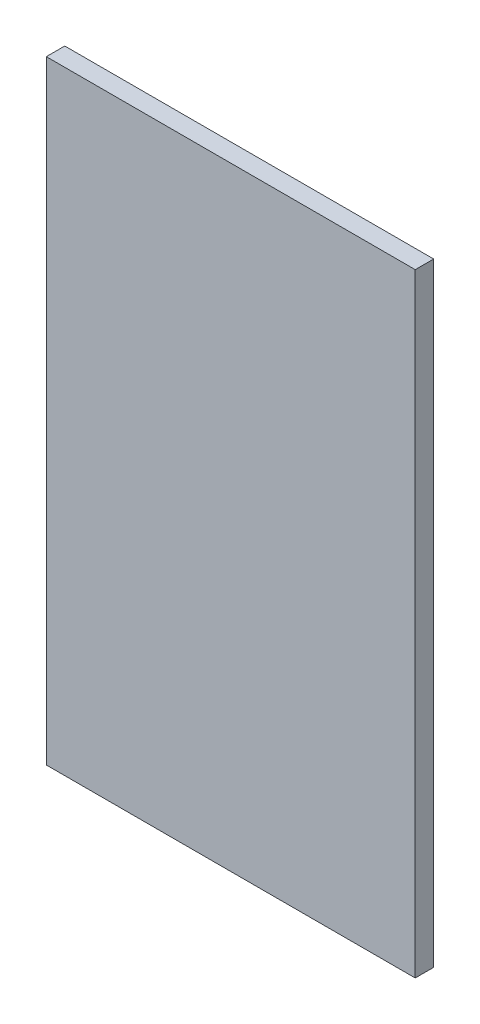
ISO-10303-21;
HEADER;
FILE_DESCRIPTION(('STEP AP214'),'2;1');
FILE_NAME('part.step','',(''),(''),'','','');
FILE_SCHEMA(('AUTOMOTIVE_DESIGN { 1 0 10303 214 1 1 1 1 }'));
ENDSEC;
DATA;
#1=APPLICATION_CONTEXT('core data for automotive mechanical design processes');
#2=APPLICATION_PROTOCOL_DEFINITION('international standard','automotive_design',2000,#1);
#3=PRODUCT_CONTEXT('',#1,'mechanical');
#4=PRODUCT('Part','Part','',(#3));
#5=PRODUCT_RELATED_PRODUCT_CATEGORY('part','',(#4));
#6=PRODUCT_DEFINITION_FORMATION('','',#4);
#7=PRODUCT_DEFINITION_CONTEXT('part definition',#1,'design');
#8=PRODUCT_DEFINITION('design','',#6,#7);
#9=PRODUCT_DEFINITION_SHAPE('','',#8);
#10=(LENGTH_UNIT() NAMED_UNIT(*) SI_UNIT(.MILLI.,.METRE.));
#11=(NAMED_UNIT(*) PLANE_ANGLE_UNIT() SI_UNIT($,.RADIAN.));
#12=(NAMED_UNIT(*) SI_UNIT($,.STERADIAN.) SOLID_ANGLE_UNIT());
#13=UNCERTAINTY_MEASURE_WITH_UNIT(LENGTH_MEASURE(1.E-05),#10,'distance_accuracy_value','');
#14=(GEOMETRIC_REPRESENTATION_CONTEXT(3) GLOBAL_UNCERTAINTY_ASSIGNED_CONTEXT((#13)) GLOBAL_UNIT_ASSIGNED_CONTEXT((#10,
#11,#12)) REPRESENTATION_CONTEXT('',''));
#15=CARTESIAN_POINT('',(0.,0.,0.));
#16=DIRECTION('',(0.,0.,1.));
#17=DIRECTION('',(1.,0.,0.));
#18=AXIS2_PLACEMENT_3D('',#15,#16,#17);
#19=CARTESIAN_POINT('',(0.,1662.9,50.));
#20=DIRECTION('',(1.,0.,0.));
#21=DIRECTION('',(0.,1.,0.));
#22=AXIS2_PLACEMENT_3D('',#19,#20,#21);
#23=PLANE('',#22);
#24=DIRECTION('',(0.,-1.,0.));
#25=VECTOR('',#24,1.);
#26=CARTESIAN_POINT('',(0.,1662.9,0.));
#27=LINE('',#26,#25);
#28=CARTESIAN_POINT('',(0.,1662.9,0.));
#29=VERTEX_POINT('',#28);
#30=CARTESIAN_POINT('',(0.,0.,0.));
#31=VERTEX_POINT('',#30);
#32=EDGE_CURVE('E111',#29,#31,#27,.T.);
#33=ORIENTED_EDGE('',*,*,#32,.T.);
#34=DIRECTION('',(0.,0.,-1.));
#35=VECTOR('',#34,1.);
#36=CARTESIAN_POINT('',(0.,0.,50.));
#37=LINE('',#36,#35);
#38=CARTESIAN_POINT('',(0.,0.,50.));
#39=VERTEX_POINT('',#38);
#40=EDGE_CURVE('E11',#39,#31,#37,.T.);
#41=ORIENTED_EDGE('',*,*,#40,.F.);
#42=DIRECTION('',(0.,-1.,0.));
#43=VECTOR('',#42,1.);
#44=CARTESIAN_POINT('',(0.,1662.9,50.));
#45=LINE('',#44,#43);
#46=CARTESIAN_POINT('',(0.,1662.9,50.));
#47=VERTEX_POINT('',#46);
#48=EDGE_CURVE('E95',#47,#39,#45,.T.);
#49=ORIENTED_EDGE('',*,*,#48,.F.);
#50=DIRECTION('',(0.,0.,-1.));
#51=VECTOR('',#50,1.);
#52=CARTESIAN_POINT('',(0.,1662.9,50.));
#53=LINE('',#52,#51);
#54=EDGE_CURVE('E107',#47,#29,#53,.T.);
#55=ORIENTED_EDGE('',*,*,#54,.T.);
#56=EDGE_LOOP('',(#33,#41,#49,#55));
#57=FACE_BOUND('',#56,.T.);
#58=ADVANCED_FACE('F43',(#57),#23,.F.);
#59=CARTESIAN_POINT('',(0.,0.,50.));
#60=DIRECTION('',(0.,1.,0.));
#61=DIRECTION('',(0.,0.,1.));
#62=AXIS2_PLACEMENT_3D('',#59,#60,#61);
#63=PLANE('',#62);
#64=DIRECTION('',(1.,0.,0.));
#65=VECTOR('',#64,1.);
#66=CARTESIAN_POINT('',(0.,0.,0.));
#67=LINE('',#66,#65);
#68=CARTESIAN_POINT('',(1000.,0.,0.));
#69=VERTEX_POINT('',#68);
#70=EDGE_CURVE('E100',#31,#69,#67,.T.);
#71=ORIENTED_EDGE('',*,*,#70,.T.);
#72=DIRECTION('',(0.,0.,-1.));
#73=VECTOR('',#72,1.);
#74=CARTESIAN_POINT('',(1000.,0.,50.));
#75=LINE('',#74,#73);
#76=CARTESIAN_POINT('',(1000.,0.,50.));
#77=VERTEX_POINT('',#76);
#78=EDGE_CURVE('E52',#77,#69,#75,.T.);
#79=ORIENTED_EDGE('',*,*,#78,.F.);
#80=DIRECTION('',(1.,0.,0.));
#81=VECTOR('',#80,1.);
#82=CARTESIAN_POINT('',(0.,0.,50.));
#83=LINE('',#82,#81);
#84=EDGE_CURVE('E90',#39,#77,#83,.T.);
#85=ORIENTED_EDGE('',*,*,#84,.F.);
#86=ORIENTED_EDGE('',*,*,#40,.T.);
#87=EDGE_LOOP('',(#71,#79,#85,#86));
#88=FACE_BOUND('',#87,.T.);
#89=ADVANCED_FACE('F99',(#88),#63,.F.);
#90=CARTESIAN_POINT('',(1000.,0.,50.));
#91=DIRECTION('',(-1.,0.,0.));
#92=DIRECTION('',(0.,0.,1.));
#93=AXIS2_PLACEMENT_3D('',#90,#91,#92);
#94=PLANE('',#93);
#95=DIRECTION('',(0.,1.,0.));
#96=VECTOR('',#95,1.);
#97=CARTESIAN_POINT('',(1000.,0.,0.));
#98=LINE('',#97,#96);
#99=CARTESIAN_POINT('',(1000.,1662.9,0.));
#100=VERTEX_POINT('',#99);
#101=EDGE_CURVE('E77',#69,#100,#98,.T.);
#102=ORIENTED_EDGE('',*,*,#101,.T.);
#103=DIRECTION('',(0.,0.,-1.));
#104=VECTOR('',#103,1.);
#105=CARTESIAN_POINT('',(1000.,1662.9,50.));
#106=LINE('',#105,#104);
#107=CARTESIAN_POINT('',(1000.,1662.9,50.));
#108=VERTEX_POINT('',#107);
#109=EDGE_CURVE('E102',#108,#100,#106,.T.);
#110=ORIENTED_EDGE('',*,*,#109,.F.);
#111=DIRECTION('',(0.,1.,0.));
#112=VECTOR('',#111,1.);
#113=CARTESIAN_POINT('',(1000.,0.,50.));
#114=LINE('',#113,#112);
#115=EDGE_CURVE('E93',#77,#108,#114,.T.);
#116=ORIENTED_EDGE('',*,*,#115,.F.);
#117=ORIENTED_EDGE('',*,*,#78,.T.);
#118=EDGE_LOOP('',(#102,#110,#116,#117));
#119=FACE_BOUND('',#118,.T.);
#120=ADVANCED_FACE('F103',(#119),#94,.F.);
#121=CARTESIAN_POINT('',(1000.,1662.9,50.));
#122=DIRECTION('',(0.,-1.,0.));
#123=DIRECTION('',(1.,0.,0.));
#124=AXIS2_PLACEMENT_3D('',#121,#122,#123);
#125=PLANE('',#124);
#126=DIRECTION('',(-1.,0.,0.));
#127=VECTOR('',#126,1.);
#128=CARTESIAN_POINT('',(1000.,1662.9,0.));
#129=LINE('',#128,#127);
#130=EDGE_CURVE('E83',#100,#29,#129,.T.);
#131=ORIENTED_EDGE('',*,*,#130,.T.);
#132=ORIENTED_EDGE('',*,*,#54,.F.);
#133=DIRECTION('',(-1.,0.,0.));
#134=VECTOR('',#133,1.);
#135=CARTESIAN_POINT('',(1000.,1662.9,50.));
#136=LINE('',#135,#134);
#137=EDGE_CURVE('E60',#108,#47,#136,.T.);
#138=ORIENTED_EDGE('',*,*,#137,.F.);
#139=ORIENTED_EDGE('',*,*,#109,.T.);
#140=EDGE_LOOP('',(#131,#132,#138,#139));
#141=FACE_BOUND('',#140,.T.);
#142=ADVANCED_FACE('F124',(#141),#125,.F.);
#143=CARTESIAN_POINT('',(0.,0.,50.));
#144=DIRECTION('',(0.,0.,1.));
#145=DIRECTION('',(1.,0.,0.));
#146=AXIS2_PLACEMENT_3D('',#143,#144,#145);
#147=PLANE('',#146);
#148=ORIENTED_EDGE('',*,*,#48,.T.);
#149=ORIENTED_EDGE('',*,*,#84,.T.);
#150=ORIENTED_EDGE('',*,*,#115,.T.);
#151=ORIENTED_EDGE('',*,*,#137,.T.);
#152=EDGE_LOOP('',(#148,#149,#150,#151));
#153=FACE_BOUND('',#152,.T.);
#154=ADVANCED_FACE('F91',(#153),#147,.T.);
#155=CARTESIAN_POINT('',(0.,0.,0.));
#156=DIRECTION('',(0.,0.,1.));
#157=DIRECTION('',(1.,0.,0.));
#158=AXIS2_PLACEMENT_3D('',#155,#156,#157);
#159=PLANE('',#158);
#160=ORIENTED_EDGE('',*,*,#32,.F.);
#161=ORIENTED_EDGE('',*,*,#130,.F.);
#162=ORIENTED_EDGE('',*,*,#101,.F.);
#163=ORIENTED_EDGE('',*,*,#70,.F.);
#164=EDGE_LOOP('',(#160,#161,#162,#163));
#165=FACE_BOUND('',#164,.T.);
#166=ADVANCED_FACE('F127',(#165),#159,.F.);
#167=CLOSED_SHELL('',(#58,#89,#120,#142,#154,#166));
#168=MANIFOLD_SOLID_BREP('B2',#167);
#169=ADVANCED_BREP_SHAPE_REPRESENTATION('',(#18,#168),#14);
#170=SHAPE_DEFINITION_REPRESENTATION(#9,#169);
ENDSEC;
END-ISO-10303-21;
